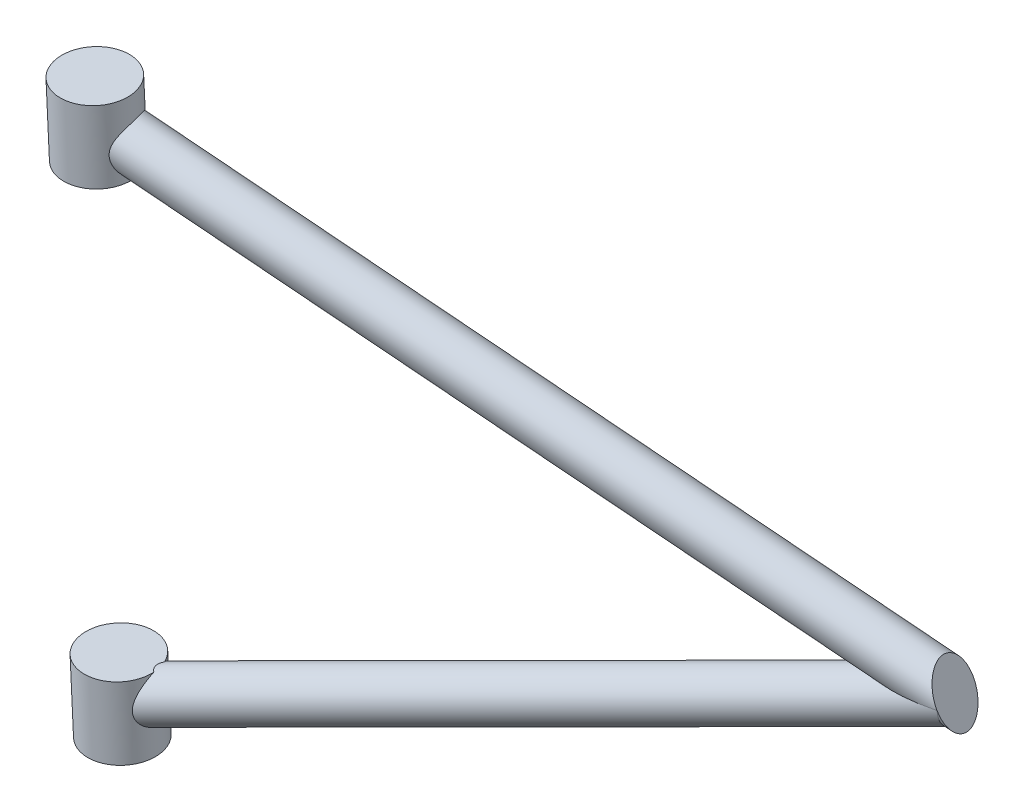
ISO-10303-21;
HEADER;
FILE_DESCRIPTION(('STEP AP214'),'2;1');
FILE_NAME('part.step','',(''),(''),'','','');
FILE_SCHEMA(('AUTOMOTIVE_DESIGN { 1 0 10303 214 1 1 1 1 }'));
ENDSEC;
DATA;
#1=APPLICATION_CONTEXT('core data for automotive mechanical design processes');
#2=APPLICATION_PROTOCOL_DEFINITION('international standard','automotive_design',2000,#1);
#3=PRODUCT_CONTEXT('',#1,'mechanical');
#4=PRODUCT('Part','Part','',(#3));
#5=PRODUCT_RELATED_PRODUCT_CATEGORY('part','',(#4));
#6=PRODUCT_DEFINITION_FORMATION('','',#4);
#7=PRODUCT_DEFINITION_CONTEXT('part definition',#1,'design');
#8=PRODUCT_DEFINITION('design','',#6,#7);
#9=PRODUCT_DEFINITION_SHAPE('','',#8);
#10=(LENGTH_UNIT() NAMED_UNIT(*) SI_UNIT(.MILLI.,.METRE.));
#11=(NAMED_UNIT(*) PLANE_ANGLE_UNIT() SI_UNIT($,.RADIAN.));
#12=(NAMED_UNIT(*) SI_UNIT($,.STERADIAN.) SOLID_ANGLE_UNIT());
#13=UNCERTAINTY_MEASURE_WITH_UNIT(LENGTH_MEASURE(1.E-05),#10,'distance_accuracy_value','');
#14=(GEOMETRIC_REPRESENTATION_CONTEXT(3) GLOBAL_UNCERTAINTY_ASSIGNED_CONTEXT((#13)) GLOBAL_UNIT_ASSIGNED_CONTEXT((#10,
#11,#12)) REPRESENTATION_CONTEXT('',''));
#15=CARTESIAN_POINT('',(0.,0.,0.));
#16=DIRECTION('',(0.,0.,1.));
#17=DIRECTION('',(1.,0.,0.));
#18=AXIS2_PLACEMENT_3D('',#15,#16,#17);
#19=CARTESIAN_POINT('',(255.,-221.47,-254.503));
#20=DIRECTION('',(0.912524270681738,0.366844617908996,-0.18089909266761));
#21=DIRECTION('',(-0.372998472957095,0.927831956321658,0.));
#22=AXIS2_PLACEMENT_3D('',#19,#20,#21);
#23=CYLINDRICAL_SURFACE('',#22,9.52500000000002);
#24=CARTESIAN_POINT('',(293.242179047782,-206.096230762816,-262.084141360994));
#25=DIRECTION('',(0.,0.998892249777093,0.0470560658710238));
#26=DIRECTION('',(0.977268280554209,0.00997618647777122,-0.211771536156257));
#27=AXIS2_PLACEMENT_3D('',#24,#25,#26);
#28=ELLIPSE('',#27,26.6116574264945,9.52500000000002);
#29=CARTESIAN_POINT('',(268.999181284131,-206.479491491884,-253.948395951266));
#30=VERTEX_POINT('',#29);
#31=CARTESIAN_POINT('',(267.803485256219,-206.220132528784,-259.453991316177));
#32=VERTEX_POINT('',#31);
#33=EDGE_CURVE('E80',#30,#32,#28,.F.);
#34=ORIENTED_EDGE('',*,*,#33,.F.);
#35=CARTESIAN_POINT('',(267.803485256219,-206.220132528784,-259.453991316177));
#36=CARTESIAN_POINT('',(267.697365527533,-206.314287046579,-259.698635479323));
#37=CARTESIAN_POINT('',(267.586764390849,-206.42159580225,-259.935753123484));
#38=CARTESIAN_POINT('',(267.3590656013,-206.659148812205,-260.394082141548));
#39=CARTESIAN_POINT('',(267.241984498495,-206.789336331361,-260.615330999056));
#40=CARTESIAN_POINT('',(266.886711742009,-207.206658583498,-261.250682509158));
#41=CARTESIAN_POINT('',(266.641879237606,-207.522929172958,-261.642177585505));
#42=CARTESIAN_POINT('',(266.235273501451,-208.092730241839,-262.239418803081));
#43=CARTESIAN_POINT('',(266.074316155262,-208.329666023735,-262.462324034543));
#44=CARTESIAN_POINT('',(265.753981376019,-208.824652753416,-262.884808049921));
#45=CARTESIAN_POINT('',(265.594604180185,-209.08270681934,-263.084383378549));
#46=CARTESIAN_POINT('',(265.279342301922,-209.618803267741,-263.462697257364));
#47=CARTESIAN_POINT('',(265.123488835937,-209.896969922729,-263.641284482501));
#48=CARTESIAN_POINT('',(264.819309695939,-210.469689099346,-263.97724993632));
#49=CARTESIAN_POINT('',(264.670983486587,-210.764240452564,-264.1346296746));
#50=CARTESIAN_POINT('',(264.381269831893,-211.376181258596,-264.432862120423));
#51=CARTESIAN_POINT('',(264.240163394191,-211.693965555147,-264.573178177829));
#52=CARTESIAN_POINT('',(263.973061649822,-212.344290165365,-264.832817021957));
#53=CARTESIAN_POINT('',(263.847070291525,-212.676834303664,-264.952134327155));
#54=CARTESIAN_POINT('',(263.615479530347,-213.35418344376,-265.169010362527));
#55=CARTESIAN_POINT('',(263.509796042121,-213.698930568173,-265.266659084283));
#56=CARTESIAN_POINT('',(263.323918613269,-214.40060892788,-265.439720146905));
#57=CARTESIAN_POINT('',(263.243704957851,-214.757530501437,-265.515149683131));
#58=CARTESIAN_POINT('',(263.140757197253,-215.337931157684,-265.616682171021));
#59=CARTESIAN_POINT('',(263.107839746575,-215.558288084853,-265.650490284906));
#60=CARTESIAN_POINT('',(263.055221234641,-216.001787504313,-265.708623035463));
#61=CARTESIAN_POINT('',(263.035515613435,-216.224929008417,-265.732950942932));
#62=CARTESIAN_POINT('',(263.010753298342,-216.6726776378,-265.771379849267));
#63=CARTESIAN_POINT('',(263.005680130779,-216.897282829338,-265.785492335551));
#64=CARTESIAN_POINT('',(263.011298244634,-217.346752682923,-265.80274430895));
#65=CARTESIAN_POINT('',(263.021989511733,-217.571617344735,-265.805883806031));
#66=CARTESIAN_POINT('',(263.059984423546,-218.021655112976,-265.800397176217));
#67=CARTESIAN_POINT('',(263.0874217406,-218.246816002228,-265.791675675815));
#68=CARTESIAN_POINT('',(263.159066383468,-218.693611930885,-265.761625241399));
#69=CARTESIAN_POINT('',(263.203273557364,-218.915247002211,-265.740296421595));
#70=CARTESIAN_POINT('',(263.30776437712,-219.353093275263,-265.684545181846));
#71=CARTESIAN_POINT('',(263.368053812421,-219.569302493014,-265.650118044742));
#72=CARTESIAN_POINT('',(263.503297097006,-219.994461443992,-265.567923797466));
#73=CARTESIAN_POINT('',(263.578250721479,-220.203411288453,-265.520156891796));
#74=CARTESIAN_POINT('',(263.733171590505,-220.593225138195,-265.416430865558));
#75=CARTESIAN_POINT('',(263.811987994475,-220.774872676237,-265.36167938882));
#76=CARTESIAN_POINT('',(263.978462432031,-221.130423154988,-265.241300951544));
#77=CARTESIAN_POINT('',(264.06612389616,-221.3043230528,-265.175669764933));
#78=CARTESIAN_POINT('',(264.24857889433,-221.643813586958,-265.03371158526));
#79=CARTESIAN_POINT('',(264.343372946659,-221.80940361801,-264.957383814584));
#80=CARTESIAN_POINT('',(264.538437505506,-222.131975916435,-264.794240719237));
#81=CARTESIAN_POINT('',(264.638708684581,-222.288957121931,-264.707424105006));
#82=CARTESIAN_POINT('',(264.856080793585,-222.613432512373,-264.511904137335));
#83=CARTESIAN_POINT('',(264.973706227715,-222.77974489652,-264.401821371604));
#84=CARTESIAN_POINT('',(265.211812817542,-223.101071675487,-264.168997659305));
#85=CARTESIAN_POINT('',(265.332294133555,-223.25608543406,-264.046256000829));
#86=CARTESIAN_POINT('',(265.574267969116,-223.554796284649,-263.788422034612));
#87=CARTESIAN_POINT('',(265.695760939554,-223.698487995004,-263.653323918668));
#88=CARTESIAN_POINT('',(265.937968608628,-223.9743822208,-263.371221770743));
#89=CARTESIAN_POINT('',(266.058683267141,-224.106584148258,-263.224217130196));
#90=CARTESIAN_POINT('',(266.316388873185,-224.379086894282,-262.894911525225));
#91=CARTESIAN_POINT('',(266.452983883531,-224.517438018628,-262.710680519274));
#92=CARTESIAN_POINT('',(266.720771944835,-224.778357387148,-262.327661237535));
#93=CARTESIAN_POINT('',(266.851964487,-224.900924147083,-262.128871595517));
#94=CARTESIAN_POINT('',(267.106914603057,-225.129934865831,-261.717650437763));
#95=CARTESIAN_POINT('',(267.230671343288,-225.236377018868,-261.505217397907));
#96=CARTESIAN_POINT('',(267.468876424041,-225.43271743723,-261.067853372235));
#97=CARTESIAN_POINT('',(267.583325023973,-225.522616163696,-260.842922735012));
#98=CARTESIAN_POINT('',(267.802315193678,-225.686237507517,-260.379654071813));
#99=CARTESIAN_POINT('',(267.906750630271,-225.759795842173,-260.141207706006));
#100=CARTESIAN_POINT('',(268.102975695885,-225.889205563581,-259.654493838866));
#101=CARTESIAN_POINT('',(268.194765111246,-225.945056651182,-259.406226171689));
#102=CARTESIAN_POINT('',(268.36445666864,-226.038678078082,-258.901741183751));
#103=CARTESIAN_POINT('',(268.44236278672,-226.076453599294,-258.645526163796));
#104=CARTESIAN_POINT('',(268.583397962621,-226.133680431828,-258.127059212255));
#105=CARTESIAN_POINT('',(268.646527716311,-226.15313260619,-257.864807565594));
#106=CARTESIAN_POINT('',(268.75456089052,-226.173041180107,-257.350001463026));
#107=CARTESIAN_POINT('',(268.800236085503,-226.17442507342,-257.097643977992));
#108=CARTESIAN_POINT('',(268.87754495621,-226.160559049983,-256.591249747588));
#109=CARTESIAN_POINT('',(268.909179149581,-226.145309746517,-256.337213064475));
#110=CARTESIAN_POINT('',(268.958465129282,-226.098254186145,-255.829342197431));
#111=CARTESIAN_POINT('',(268.97611791716,-226.066449115471,-255.575508000297));
#112=CARTESIAN_POINT('',(268.997780159279,-225.986437433502,-255.06985384672));
#113=CARTESIAN_POINT('',(269.001789410141,-225.938230577724,-254.818033920359));
#114=CARTESIAN_POINT('',(268.996762287689,-225.825707993507,-254.318544779101));
#115=CARTESIAN_POINT('',(268.987744850636,-225.761415759862,-254.070870067635));
#116=CARTESIAN_POINT('',(268.957530962621,-225.616923119472,-253.580973567274));
#117=CARTESIAN_POINT('',(268.936334552204,-225.536722765687,-253.338751760229));
#118=CARTESIAN_POINT('',(268.882802768389,-225.360597511825,-252.861222854839));
#119=CARTESIAN_POINT('',(268.850461702744,-225.264664589324,-252.625919356878));
#120=CARTESIAN_POINT('',(268.775907958965,-225.057297669075,-252.163861958913));
#121=CARTESIAN_POINT('',(268.733694983814,-224.94586320497,-251.937108316386));
#122=CARTESIAN_POINT('',(268.638427804418,-224.70137759742,-251.481962002));
#123=CARTESIAN_POINT('',(268.584920879624,-224.567498865722,-251.254107944126));
#124=CARTESIAN_POINT('',(268.470559133134,-224.282804564353,-250.811147094706));
#125=CARTESIAN_POINT('',(268.409703629115,-224.13198742202,-250.596041489638));
#126=CARTESIAN_POINT('',(268.282914006161,-223.81350185564,-250.180367343564));
#127=CARTESIAN_POINT('',(268.21698123708,-223.645837906937,-249.979794966055));
#128=CARTESIAN_POINT('',(268.082581578995,-223.293675776162,-249.59495297393));
#129=CARTESIAN_POINT('',(268.014115195036,-223.109180938497,-249.410680134762));
#130=CARTESIAN_POINT('',(267.889441483938,-222.757180467935,-249.090924796078));
#131=CARTESIAN_POINT('',(267.83317936084,-222.592326466294,-248.952538990793));
#132=CARTESIAN_POINT('',(267.722651266223,-222.25151404732,-248.689326778223));
#133=CARTESIAN_POINT('',(267.668384903767,-222.075557823276,-248.564497705929));
#134=CARTESIAN_POINT('',(267.563747133932,-221.713228224221,-248.329677098308));
#135=CARTESIAN_POINT('',(267.513370789218,-221.526868589261,-248.219666618114));
#136=CARTESIAN_POINT('',(267.4182587498,-221.144323935223,-248.015368122386));
#137=CARTESIAN_POINT('',(267.373523009128,-220.948138996235,-247.92107997872));
#138=CARTESIAN_POINT('',(267.291137225037,-220.546013503638,-247.748638257899));
#139=CARTESIAN_POINT('',(267.2535278762,-220.340024858359,-247.670577111481));
#140=CARTESIAN_POINT('',(267.187082074715,-219.920901255214,-247.531833206973));
#141=CARTESIAN_POINT('',(267.158245482821,-219.707766410837,-247.471150173047));
#142=CARTESIAN_POINT('',(267.110235562994,-219.276173299073,-247.367297249279));
#143=CARTESIAN_POINT('',(267.091064070753,-219.05771402867,-247.324130686644));
#144=CARTESIAN_POINT('',(267.062724596509,-218.617469337366,-247.255007864885));
#145=CARTESIAN_POINT('',(267.053556655437,-218.395683902859,-247.229051676181));
#146=CARTESIAN_POINT('',(267.045348670539,-217.968250588951,-247.19502778059));
#147=CARTESIAN_POINT('',(267.045565007181,-217.762713603364,-247.185707712271));
#148=CARTESIAN_POINT('',(267.053792930777,-217.351595295943,-247.180270105336));
#149=CARTESIAN_POINT('',(267.061807327794,-217.146013984837,-247.184157327279));
#150=CARTESIAN_POINT('',(267.096519483449,-216.530787761495,-247.214349430058));
#151=CARTESIAN_POINT('',(267.133884626441,-216.122537567518,-247.259176045046));
#152=CARTESIAN_POINT('',(267.222325638461,-215.381368977004,-247.380627271946));
#153=CARTESIAN_POINT('',(267.270207937088,-215.046942942879,-247.450938854214));
#154=CARTESIAN_POINT('',(267.377018936706,-214.386439361572,-247.618189330147));
#155=CARTESIAN_POINT('',(267.435954174913,-214.060366885459,-247.71514399763));
#156=CARTESIAN_POINT('',(267.561389779737,-213.416716646475,-247.9336507454));
#157=CARTESIAN_POINT('',(267.627918198398,-213.099176112066,-248.055295417468));
#158=CARTESIAN_POINT('',(267.765029228637,-212.474758490432,-248.321306075396));
#159=CARTESIAN_POINT('',(267.835611193412,-212.167879714442,-248.465668442679));
#160=CARTESIAN_POINT('',(267.980843351858,-211.553014635479,-248.782694691098));
#161=CARTESIAN_POINT('',(268.0555401776,-211.245519516577,-248.956290190469));
#162=CARTESIAN_POINT('',(268.202991109672,-210.644308733987,-249.32672039377));
#163=CARTESIAN_POINT('',(268.275745048135,-210.350594259308,-249.523557097843));
#164=CARTESIAN_POINT('',(268.415818484292,-209.780532346564,-249.939235286135));
#165=CARTESIAN_POINT('',(268.483167743511,-209.504091965957,-250.15793886129));
#166=CARTESIAN_POINT('',(268.609798910895,-208.969228518461,-250.618611208845));
#167=CARTESIAN_POINT('',(268.669081435061,-208.710804076553,-250.860578202365));
#168=CARTESIAN_POINT('',(268.765852461967,-208.26341636258,-251.318946387353));
#169=CARTESIAN_POINT('',(268.805338585521,-208.070684366789,-251.531243647368));
#170=CARTESIAN_POINT('',(268.874936386724,-207.701749340829,-251.970974377624));
#171=CARTESIAN_POINT('',(268.905055549102,-207.525533192642,-252.198395585667));
#172=CARTESIAN_POINT('',(268.95419156177,-207.190432647219,-252.670920659274));
#173=CARTESIAN_POINT('',(268.973077255322,-207.031769957774,-252.916197267341));
#174=CARTESIAN_POINT('',(268.997070890751,-206.73735109464,-253.421580500344));
#175=CARTESIAN_POINT('',(269.002142266349,-206.601656605006,-253.681724626914));
#176=CARTESIAN_POINT('',(268.999181284131,-206.479491491884,-253.948395951266));
#177=B_SPLINE_CURVE_WITH_KNOTS('',3,(#35,#36,#37,#38,#39,#40,#41,#42,#43,#44,#45,#46,#47,#48,
#49,#50,#51,#52,#53,#54,#55,#56,#57,#58,#59,#60,#61,#62,#63,#64,#65,#66,#67,#68,#69,#70,#71,#72,
#73,#74,#75,#76,#77,#78,#79,#80,#81,#82,#83,#84,#85,#86,#87,#88,#89,#90,#91,#92,#93,#94,#95,#96,
#97,#98,#99,#100,#101,#102,#103,#104,#105,#106,#107,#108,#109,#110,#111,#112,#113,#114,#115,
#116,#117,#118,#119,#120,#121,#122,#123,#124,#125,#126,#127,#128,#129,#130,#131,#132,#133,#134,
#135,#136,#137,#138,#139,#140,#141,#142,#143,#144,#145,#146,#147,#148,#149,#150,#151,#152,#153,
#154,#155,#156,#157,#158,#159,#160,#161,#162,#163,#164,#165,#166,#167,#168,#169,#170,#171,#172,
#173,#174,#175,#176),.UNSPECIFIED.,.F.,.F.,(4,2,2,2,2,2,2,2,2,2,2,2,2,2,2,2,2,2,2,2,2,2,2,2,2,2,
2,2,2,2,2,2,2,2,2,2,2,2,2,2,2,2,2,2,2,2,2,2,2,2,2,2,2,2,2,2,2,2,2,2,2,2,2,2,2,2,2,2,2,2,4),(0.,
0.847248957157209,1.69242580052789,3.3627657640452,4.45048572585789,5.53836658145481,
6.63366380567474,7.7288830228253,8.85260269563985,9.97661527103477,11.0958685200099,
12.214253292855,12.8897999019046,13.5651132316117,14.2396659749776,14.9142181056374,
15.594226457347,16.2742286490018,16.9544759652561,17.6347128537404,18.2503947330981,
18.8663163283093,19.4822827225457,20.0983249244541,20.7922888745161,21.4862918728688,
22.1806227833065,22.8749892047906,23.6775899204243,24.4802660513897,25.2830320066978,
26.0857755818625,26.8962571907386,27.7067524913827,28.517015299415,29.3272399417498,
30.0956997057354,30.8641311366941,31.6325075166236,32.4008953503885,33.1681673395538,
33.935436774422,34.7030986823461,35.4707836899619,36.2787608460513,37.0868130815586,
37.8946512231765,38.7023291903113,39.3690957519282,40.0357310011377,40.7015057318462,
41.3672750364114,42.0367385694382,42.7061914757579,43.3757714834116,44.0453542307185,
44.6619834053258,45.2788348670851,46.5121712393655,47.5460979811356,48.580638174395,
49.6191322393976,50.6574610554916,51.7392464537718,52.8211250187368,53.8965658681635,
54.9719245473783,55.8393415741109,56.7060636942321,57.5827161452231,58.4616868366877),.UNSPECIFIED.);
#178=EDGE_CURVE('E86',#32,#30,#177,.T.);
#179=ORIENTED_EDGE('',*,*,#178,.F.);
#180=EDGE_LOOP('',(#34,#179));
#181=FACE_BOUND('',#180,.T.);
#182=CARTESIAN_POINT('',(536.966082,-108.116588,-310.400043));
#183=DIRECTION('',(0.977042799081254,0.0314302037809526,-0.210711914835768));
#184=DIRECTION('',(-0.0209918277884314,0.998447490299481,0.0515941109116967));
#185=AXIS2_PLACEMENT_3D('',#182,#183,#184);
#186=ELLIPSE('',#185,10.1198136751925,9.525);
#187=CARTESIAN_POINT('',(538.985442921555,-108.554608710622,-301.10187413051));
#188=VERTEX_POINT('',#187);
#189=CARTESIAN_POINT('',(534.946721078445,-107.678567289377,-319.69821186949));
#190=VERTEX_POINT('',#189);
#191=EDGE_CURVE('E93',#188,#190,#186,.T.);
#192=ORIENTED_EDGE('',*,*,#191,.F.);
#193=CARTESIAN_POINT('',(536.966082,-108.116588,-310.400043));
#194=DIRECTION('',(-0.0209918277884314,0.998447490299481,0.0515941109116967));
#195=DIRECTION('',(0.977042799081254,0.0314302037809526,-0.210711914835768));
#196=AXIS2_PLACEMENT_3D('',#193,#194,#195);
#197=ELLIPSE('',#196,28.1983093968674,9.525);
#198=EDGE_CURVE('E119',#190,#188,#197,.T.);
#199=ORIENTED_EDGE('',*,*,#198,.F.);
#200=EDGE_LOOP('',(#192,#199));
#201=FACE_BOUND('',#200,.T.);
#202=ADVANCED_FACE('F67',(#181,#201),#23,.T.);
#203=CARTESIAN_POINT('',(255.,-14.5,-244.753));
#204=DIRECTION('',(0.926705770492292,-0.307678965136663,-0.215754650815965));
#205=DIRECTION('',(0.31510033175296,0.949058365396552,0.));
#206=AXIS2_PLACEMENT_3D('',#203,#204,#205);
#207=CYLINDRICAL_SURFACE('',#206,9.52499999999998);
#208=CARTESIAN_POINT('',(268.726824760883,-9.02122951178209,-247.250098117072));
#209=CARTESIAN_POINT('',(268.676288530235,-9.00445198597454,-247.501640042863));
#210=CARTESIAN_POINT('',(268.618762691404,-8.99633112635366,-247.752376592043));
#211=CARTESIAN_POINT('',(268.4902025195,-8.99747023854408,-248.250336732159));
#212=CARTESIAN_POINT('',(268.419166756123,-9.00673205158942,-248.497559948154));
#213=CARTESIAN_POINT('',(268.26430576037,-9.04257696507422,-248.986808957903));
#214=CARTESIAN_POINT('',(268.180474735553,-9.06916792837075,-249.228832340788));
#215=CARTESIAN_POINT('',(268.001055496051,-9.13949319043361,-249.705915076184));
#216=CARTESIAN_POINT('',(267.905467525869,-9.18322713272696,-249.940974573394));
#217=CARTESIAN_POINT('',(267.704010049842,-9.28743506475234,-250.402102427346));
#218=CARTESIAN_POINT('',(267.59816639998,-9.34786763304748,-250.628191468837));
#219=CARTESIAN_POINT('',(267.37740915214,-9.48519116807679,-251.07072761641));
#220=CARTESIAN_POINT('',(267.262495497646,-9.56208223736834,-251.2871746624));
#221=CARTESIAN_POINT('',(267.025135257315,-9.73200191766136,-251.709419423601));
#222=CARTESIAN_POINT('',(266.902686502832,-9.82503518863161,-251.91521404131));
#223=CARTESIAN_POINT('',(266.652004823838,-10.0268960232909,-252.315201896446));
#224=CARTESIAN_POINT('',(266.523771766162,-10.135723950729,-252.509394866543));
#225=CARTESIAN_POINT('',(266.257990376271,-10.37372353331,-252.893239052608));
#226=CARTESIAN_POINT('',(266.120276202222,-10.5035511022297,-253.082369018426));
#227=CARTESIAN_POINT('',(265.842879496114,-10.7797917911539,-253.446577113206));
#228=CARTESIAN_POINT('',(265.703196820934,-10.9262061226147,-253.621654214184));
#229=CARTESIAN_POINT('',(265.424383563167,-11.2354446840216,-253.957164411029));
#230=CARTESIAN_POINT('',(265.285252996112,-11.3982693722353,-254.117597097705));
#231=CARTESIAN_POINT('',(265.010343203832,-11.7401856535472,-254.423270297936));
#232=CARTESIAN_POINT('',(264.874563513612,-11.9192749733077,-254.568512928546));
#233=CARTESIAN_POINT('',(264.628040923878,-12.267307728285,-254.824035864827));
#234=CARTESIAN_POINT('',(264.516456347192,-12.43415469064,-254.936363174754));
#235=CARTESIAN_POINT('',(264.300224103738,-12.7795307333661,-255.149079245481));
#236=CARTESIAN_POINT('',(264.195575195986,-12.958057712435,-255.249470144605));
#237=CARTESIAN_POINT('',(263.99561101844,-13.3262181674255,-255.43789563867));
#238=CARTESIAN_POINT('',(263.900285459151,-13.515839021735,-255.525943902869));
#239=CARTESIAN_POINT('',(263.721185832183,-13.9056787326092,-255.689509327515));
#240=CARTESIAN_POINT('',(263.637411641543,-14.1058974763313,-255.765026621352));
#241=CARTESIAN_POINT('',(263.483061700098,-14.5174320546719,-255.90382351464));
#242=CARTESIAN_POINT('',(263.412592894543,-14.7288216595263,-255.967004082436));
#243=CARTESIAN_POINT('',(263.287610092421,-15.1596821705019,-256.080277081496));
#244=CARTESIAN_POINT('',(263.233095631416,-15.3791528411706,-256.130369893746));
#245=CARTESIAN_POINT('',(263.141372793277,-15.8241215844694,-256.217531734547));
#246=CARTESIAN_POINT('',(263.104157846816,-16.049617334677,-256.254605705569));
#247=CARTESIAN_POINT('',(263.047547142388,-16.504520885996,-256.316057701449));
#248=CARTESIAN_POINT('',(263.028150729856,-16.7339285430879,-256.340436192663));
#249=CARTESIAN_POINT('',(263.008147517757,-17.1671959806575,-256.374834768234));
#250=CARTESIAN_POINT('',(263.005587390457,-17.3708635549028,-256.38621346761));
#251=CARTESIAN_POINT('',(263.013423633696,-17.7782789631749,-256.399930904499));
#252=CARTESIAN_POINT('',(263.023824632083,-17.9820267998868,-256.402266411863));
#253=CARTESIAN_POINT('',(263.0731348909,-18.5918328562219,-256.396378199163));
#254=CARTESIAN_POINT('',(263.130151891372,-18.9964409360988,-256.375258802721));
#255=CARTESIAN_POINT('',(263.267231293086,-19.7115667802688,-256.309632909995));
#256=CARTESIAN_POINT('',(263.340027517566,-20.024140917216,-256.270908733129));
#257=CARTESIAN_POINT('',(263.5055674067,-20.6412662141407,-256.17516250565));
#258=CARTESIAN_POINT('',(263.598321825263,-20.9458129490835,-256.118130582245));
#259=CARTESIAN_POINT('',(263.799977631537,-21.5463255489647,-255.986321595786));
#260=CARTESIAN_POINT('',(263.908916712175,-21.842269401345,-255.911502857612));
#261=CARTESIAN_POINT('',(264.139319909855,-22.4241037243651,-255.744444398948));
#262=CARTESIAN_POINT('',(264.260782060857,-22.7099957636511,-255.652207411125));
#263=CARTESIAN_POINT('',(264.518273357768,-23.2820834100239,-255.446189945533));
#264=CARTESIAN_POINT('',(264.654686517617,-23.5678532153795,-255.331707742645));
#265=CARTESIAN_POINT('',(264.935086867388,-24.1269581013663,-255.083176933669));
#266=CARTESIAN_POINT('',(265.07907503956,-24.4002915607677,-254.949125786062));
#267=CARTESIAN_POINT('',(265.371833191247,-24.9328068305056,-254.660802140949));
#268=CARTESIAN_POINT('',(265.520596114291,-25.1920081230896,-254.50655853266));
#269=CARTESIAN_POINT('',(265.82060268252,-25.6948392265771,-254.176631414043));
#270=CARTESIAN_POINT('',(265.971845609508,-25.9384734489337,-254.000954019127));
#271=CARTESIAN_POINT('',(266.238676319168,-26.352537856558,-253.670966430631));
#272=CARTESIAN_POINT('',(266.354281833975,-26.5267059850453,-253.521351987368));
#273=CARTESIAN_POINT('',(266.584224114413,-26.8631525877641,-253.208346635083));
#274=CARTESIAN_POINT('',(266.698560915827,-27.0254313980387,-253.044956115713));
#275=CARTESIAN_POINT('',(266.924479383203,-27.3362632983389,-252.70415754013));
#276=CARTESIAN_POINT('',(267.036063645957,-27.4848297185091,-252.526763415229));
#277=CARTESIAN_POINT('',(267.255039467324,-27.7664131295551,-252.157647868692));
#278=CARTESIAN_POINT('',(267.362432451144,-27.8994354372983,-251.965931383022));
#279=CARTESIAN_POINT('',(267.550344550156,-28.1227776492559,-251.608278452165));
#280=CARTESIAN_POINT('',(267.631927577974,-28.2163071954066,-251.444902454867));
#281=CARTESIAN_POINT('',(267.790374647105,-28.3907890051595,-251.109476653143));
#282=CARTESIAN_POINT('',(267.867241301295,-28.4717482714663,-250.9374317493));
#283=CARTESIAN_POINT('',(268.01530363148,-28.619897644449,-250.585235195171));
#284=CARTESIAN_POINT('',(268.086501600706,-28.6870933365689,-250.405086869704));
#285=CARTESIAN_POINT('',(268.222306872138,-28.806615573027,-250.037493012394));
#286=CARTESIAN_POINT('',(268.286914142955,-28.8589420465497,-249.850047445803));
#287=CARTESIAN_POINT('',(268.409046184096,-28.9480438917704,-249.467819731855));
#288=CARTESIAN_POINT('',(268.466522366864,-28.9847163359656,-249.272997926722));
#289=CARTESIAN_POINT('',(268.573140792532,-29.0413117188694,-248.878685628907));
#290=CARTESIAN_POINT('',(268.622283046722,-29.0612346802655,-248.67919514255));
#291=CARTESIAN_POINT('',(268.711681410468,-29.0839959537429,-248.277299485232));
#292=CARTESIAN_POINT('',(268.751938745158,-29.0868366227073,-248.074894720225));
#293=CARTESIAN_POINT('',(268.823289630843,-29.0755140053631,-247.668961678572));
#294=CARTESIAN_POINT('',(268.854383615496,-29.0613515238959,-247.465433455559));
#295=CARTESIAN_POINT('',(268.904801786241,-29.0186999138597,-247.078966926209));
#296=CARTESIAN_POINT('',(268.924981038937,-28.9917515757181,-246.895966354055));
#297=CARTESIAN_POINT('',(268.958064013113,-28.9249745078107,-246.531605969082));
#298=CARTESIAN_POINT('',(268.970965059182,-28.8851410500324,-246.350246783697));
#299=CARTESIAN_POINT('',(268.989793396049,-28.7933263723226,-245.990275203744));
#300=CARTESIAN_POINT('',(268.995720570564,-28.7413449498529,-245.811662855028));
#301=CARTESIAN_POINT('',(269.001025347498,-28.6260569238007,-245.458019234233));
#302=CARTESIAN_POINT('',(269.000401527856,-28.5627478642001,-245.28298874795));
#303=CARTESIAN_POINT('',(268.99165195885,-28.3986733966934,-244.869122410357));
#304=CARTESIAN_POINT('',(268.98066984623,-28.2929735056765,-244.632291259126));
#305=CARTESIAN_POINT('',(268.948385099839,-28.0635504732574,-244.168261413666));
#306=CARTESIAN_POINT('',(268.927079042074,-27.9398213618909,-243.94106594237));
#307=CARTESIAN_POINT('',(268.875600840143,-27.6762679414899,-243.496810164444));
#308=CARTESIAN_POINT('',(268.845414580554,-27.5364182250289,-243.279766636226));
#309=CARTESIAN_POINT('',(268.777653421011,-27.2426584721528,-242.856685745628));
#310=CARTESIAN_POINT('',(268.740078315457,-27.0887480445503,-242.650648689715));
#311=CARTESIAN_POINT('',(268.643386483254,-26.7070822330017,-242.173026496221));
#312=CARTESIAN_POINT('',(268.581530156878,-26.4736150303135,-241.906546891847));
#313=CARTESIAN_POINT('',(268.449793003767,-25.9860455351558,-241.395296604415));
#314=CARTESIAN_POINT('',(268.379908970078,-25.7319350079263,-241.150534666946));
#315=CARTESIAN_POINT('',(268.235217433814,-25.2048385830268,-240.682382562861));
#316=CARTESIAN_POINT('',(268.160397503455,-24.9318049453811,-240.45905011023));
#317=CARTESIAN_POINT('',(268.00928117974,-24.3692117493213,-240.034948103136));
#318=CARTESIAN_POINT('',(267.932984987262,-24.0796544290064,-239.834175503873));
#319=CARTESIAN_POINT('',(267.780354614498,-23.4774373291483,-239.451118710635));
#320=CARTESIAN_POINT('',(267.704070744199,-23.1643731990062,-239.2694488849));
#321=CARTESIAN_POINT('',(267.557528007869,-22.5228634270082,-238.932359860162));
#322=CARTESIAN_POINT('',(267.48727104527,-22.1944129760741,-238.776948939392));
#323=CARTESIAN_POINT('',(267.357638693295,-21.5245086942079,-238.495699153315));
#324=CARTESIAN_POINT('',(267.298221230536,-21.1831116344125,-238.369745388929));
#325=CARTESIAN_POINT('',(267.195077168894,-20.4877413538703,-238.150563149337));
#326=CARTESIAN_POINT('',(267.151335785603,-20.1337803306224,-238.057303841185));
#327=CARTESIAN_POINT('',(267.098540172103,-19.5641256360974,-237.939120561874));
#328=CARTESIAN_POINT('',(267.082619957234,-19.3515806267613,-237.901874421257));
#329=CARTESIAN_POINT('',(267.059008416033,-18.9240682133002,-237.84149928021));
#330=CARTESIAN_POINT('',(267.051314145636,-18.7091017036844,-237.818365230336));
#331=CARTESIAN_POINT('',(267.044953531713,-18.2781857655523,-237.787305684723));
#332=CARTESIAN_POINT('',(267.04627587948,-18.0622379076186,-237.779361154192));
#333=CARTESIAN_POINT('',(267.058392872335,-17.6305877960783,-237.779550424714));
#334=CARTESIAN_POINT('',(267.069187592679,-17.4148855444368,-237.787684353508));
#335=CARTESIAN_POINT('',(267.100361653992,-16.9843018184482,-237.820759015783));
#336=CARTESIAN_POINT('',(267.120791424559,-16.769430731762,-237.845788480904));
#337=CARTESIAN_POINT('',(267.170767400276,-16.3434622054168,-237.912997356413));
#338=CARTESIAN_POINT('',(267.200313653999,-16.1323647858708,-237.955176858179));
#339=CARTESIAN_POINT('',(267.267565233735,-15.7154611340881,-238.056546867933));
#340=CARTESIAN_POINT('',(267.305276825023,-15.5096591014379,-238.115750450031));
#341=CARTESIAN_POINT('',(267.387470310165,-15.1049247720286,-238.25060045492));
#342=CARTESIAN_POINT('',(267.431952283366,-14.9059925558149,-238.326247070423));
#343=CARTESIAN_POINT('',(267.523400302146,-14.5271276802228,-238.488421201792));
#344=CARTESIAN_POINT('',(267.570083125769,-14.3467569947386,-238.574090202722));
#345=CARTESIAN_POINT('',(267.666615954268,-13.9936545286482,-238.758536391542));
#346=CARTESIAN_POINT('',(267.71646718663,-13.8209257531272,-238.857318676041));
#347=CARTESIAN_POINT('',(267.817892035837,-13.4836141022372,-239.067097201745));
#348=CARTESIAN_POINT('',(267.86946556749,-13.3190308249573,-239.178092839452));
#349=CARTESIAN_POINT('',(267.972983266519,-12.9982498891615,-239.411457750653));
#350=CARTESIAN_POINT('',(268.024927478074,-12.8420532497334,-239.533828401448));
#351=CARTESIAN_POINT('',(268.136276284712,-12.5135604042263,-239.809846608741));
#352=CARTESIAN_POINT('',(268.195523474195,-12.3427654691848,-239.965347052666));
#353=CARTESIAN_POINT('',(268.310985581411,-12.0129307036202,-240.289391481785));
#354=CARTESIAN_POINT('',(268.367200259503,-11.8538918017375,-240.457936495255));
#355=CARTESIAN_POINT('',(268.475003110589,-11.5476298350489,-240.807046987239));
#356=CARTESIAN_POINT('',(268.526588011956,-11.4004151334004,-240.987620811335));
#357=CARTESIAN_POINT('',(268.6236225188,-11.1181177051641,-241.359577026843));
#358=CARTESIAN_POINT('',(268.669071891497,-10.9830354389418,-241.550959827954));
#359=CARTESIAN_POINT('',(268.758521739242,-10.7067087656077,-241.971660604417));
#360=CARTESIAN_POINT('',(268.801375687973,-10.5673678252388,-242.202478098994));
#361=CARTESIAN_POINT('',(268.875613668845,-10.3053037819552,-242.675169414416));
#362=CARTESIAN_POINT('',(268.906996231909,-10.1825828087323,-242.917044646905));
#363=CARTESIAN_POINT('',(268.956794051521,-9.9543710496175,-243.40989743261));
#364=CARTESIAN_POINT('',(268.975217768954,-9.84886905600585,-243.660868934051));
#365=CARTESIAN_POINT('',(268.997914998214,-9.65557684028918,-244.170139318301));
#366=CARTESIAN_POINT('',(269.002191274601,-9.56778316094173,-244.428436759592));
#367=CARTESIAN_POINT('',(268.996329928969,-9.42594886366718,-244.898919278565));
#368=CARTESIAN_POINT('',(268.98886466854,-9.36866599817176,-245.110169551247));
#369=CARTESIAN_POINT('',(268.96390061509,-9.26611670457977,-245.535049909392));
#370=CARTESIAN_POINT('',(268.946399391262,-9.220853191573,-245.748680559108));
#371=CARTESIAN_POINT('',(268.901179366547,-9.14259773632198,-246.177080211652));
#372=CARTESIAN_POINT('',(268.873461829238,-9.10960427750102,-246.391849070468));
#373=CARTESIAN_POINT('',(268.807790515051,-9.05606213404447,-246.821305816148));
#374=CARTESIAN_POINT('',(268.76983957727,-9.03551000288257,-247.035993708957));
#375=CARTESIAN_POINT('',(268.726824760883,-9.02122951178209,-247.250098117072));
#376=B_SPLINE_CURVE_WITH_KNOTS('',3,(#208,#209,#210,#211,#212,#213,#214,#215,#216,#217,#218,
#219,#220,#221,#222,#223,#224,#225,#226,#227,#228,#229,#230,#231,#232,#233,#234,#235,#236,#237,
#238,#239,#240,#241,#242,#243,#244,#245,#246,#247,#248,#249,#250,#251,#252,#253,#254,#255,#256,
#257,#258,#259,#260,#261,#262,#263,#264,#265,#266,#267,#268,#269,#270,#271,#272,#273,#274,#275,
#276,#277,#278,#279,#280,#281,#282,#283,#284,#285,#286,#287,#288,#289,#290,#291,#292,#293,#294,
#295,#296,#297,#298,#299,#300,#301,#302,#303,#304,#305,#306,#307,#308,#309,#310,#311,#312,#313,
#314,#315,#316,#317,#318,#319,#320,#321,#322,#323,#324,#325,#326,#327,#328,#329,#330,#331,#332,
#333,#334,#335,#336,#337,#338,#339,#340,#341,#342,#343,#344,#345,#346,#347,#348,#349,#350,#351,
#352,#353,#354,#355,#356,#357,#358,#359,#360,#361,#362,#363,#364,#365,#366,#367,#368,#369,#370,
#371,#372,#373,#374,#375),.UNSPECIFIED.,.T.,.F.,(4,2,2,2,2,2,2,2,2,2,2,2,2,2,2,2,2,2,2,2,2,2,2,
2,2,2,2,2,2,2,2,2,2,2,2,2,2,2,2,2,2,2,2,2,2,2,2,2,2,2,2,2,2,2,2,2,2,2,2,2,2,2,2,2,2,2,2,2,2,2,2,
2,2,2,2,2,2,2,2,2,2,2,2,4),(0.,0.771143389564144,1.54236846596876,2.31394371872187,
3.08550292810629,3.85516518215106,4.62483223230957,5.39472184256604,6.16462918610631,
6.96642497401414,7.76827936090845,8.57015614620314,9.37192102368296,10.0613036990496,
10.7505626897401,11.4390522029537,12.1275343868521,12.8213345268121,13.5151144679663,
14.2086307370965,14.9021215288121,15.5134762726715,16.1250493670029,17.348233364939,
18.3168394884161,19.2859688307074,20.2573916532932,21.2286622004461,22.2379356933858,
23.2473403826863,24.2553163916826,25.2630054781634,26.0336365747892,26.804245881665,
27.574097991715,28.3436859980542,28.95863636804,29.5732429201388,30.1875995602927,
30.8019591263042,31.4202981960356,32.038636428207,32.6568893448735,33.275112997795,
33.8327231693502,34.390538180614,34.9483624927723,35.5063078973024,36.2838802265422,
37.0617106186656,37.8407841450655,38.6198793529212,39.6972588965833,40.7750703446171,
41.8557075522295,42.9361987355547,44.0447059876021,45.1535620519159,46.2580180144978,
47.3614295853307,48.0100051506859,48.6583485130409,49.3058788681169,49.9534143678213,
50.6043773156448,51.2553437319283,51.9068114170006,52.5582867376474,53.1728779178945,
53.7877086684453,54.4025090520381,55.0173839737455,55.7320497140423,56.4467718474946,
57.1619951260648,57.8772455323467,58.6952677739919,59.5133947384734,60.330987047306,
61.1484195805351,61.8048961444055,62.4615317803953,63.1180862293321,63.7744587146553),.UNSPECIFIED.);
#377=CARTESIAN_POINT('',(268.726824760883,-9.02122951178209,-247.250098117072));
#378=VERTEX_POINT('',#377);
#379=EDGE_CURVE('E12',#378,#378,#376,.T.);
#380=ORIENTED_EDGE('',*,*,#379,.F.);
#381=EDGE_LOOP('',(#380));
#382=FACE_BOUND('',#381,.T.);
#383=CARTESIAN_POINT('',(536.966082,-108.116588,-310.400043));
#384=DIRECTION('',(0.912524270681739,0.366844617908996,-0.18089909266761));
#385=DIRECTION('',(0.349789570295045,-0.929144915987946,-0.119737135453293));
#386=AXIS2_PLACEMENT_3D('',#383,#384,#385);
#387=ELLIPSE('',#386,12.3412648453571,9.52499999999998);
#388=EDGE_CURVE('E112',#188,#190,#387,.F.);
#389=ORIENTED_EDGE('',*,*,#388,.T.);
#390=ORIENTED_EDGE('',*,*,#198,.T.);
#391=EDGE_LOOP('',(#389,#390));
#392=FACE_BOUND('',#391,.T.);
#393=ADVANCED_FACE('F139',(#382,#392),#207,.T.);
#394=EDGE_CURVE('E108',#190,#188,#387,.F.);
#395=ORIENTED_EDGE('',*,*,#394,.T.);
#396=ORIENTED_EDGE('',*,*,#191,.T.);
#397=EDGE_LOOP('',(#395,#396));
#398=FACE_BOUND('',#397,.T.);
#399=ADVANCED_FACE('F142',(#398),#207,.T.);
#400=CARTESIAN_POINT('',(536.966082,-108.116588,-310.400043));
#401=DIRECTION('',(0.912524270681739,0.366844617908996,-0.18089909266761));
#402=DIRECTION('',(-0.372998472957094,0.927831956321658,0.));
#403=AXIS2_PLACEMENT_3D('',#400,#401,#402);
#404=PLANE('',#403);
#405=ORIENTED_EDGE('',*,*,#388,.F.);
#406=ORIENTED_EDGE('',*,*,#394,.F.);
#407=EDGE_LOOP('',(#405,#406));
#408=FACE_BOUND('',#407,.T.);
#409=ADVANCED_FACE('F69',(#408),#404,.T.);
#410=CARTESIAN_POINT('',(255.,-236.453384,-255.208841));
#411=DIRECTION('',(0.,0.998892249777093,0.0470560658710238));
#412=DIRECTION('',(0.,-0.0470560658710238,0.998892249777093));
#413=AXIS2_PLACEMENT_3D('',#410,#411,#412);
#414=PLANE('',#413);
#415=CARTESIAN_POINT('',(255.,-236.453384,-255.208841));
#416=DIRECTION('',(0.,0.998892249777093,0.0470560658710238));
#417=DIRECTION('',(0.,-0.0470560658710238,0.998892249777093));
#418=AXIS2_PLACEMENT_3D('',#415,#416,#417);
#419=CIRCLE('',#418,14.);
#420=CARTESIAN_POINT('',(255.,-237.112168922194,-241.224349503121));
#421=VERTEX_POINT('',#420);
#422=EDGE_CURVE('E109',#421,#421,#419,.T.);
#423=ORIENTED_EDGE('',*,*,#422,.F.);
#424=EDGE_LOOP('',(#423));
#425=FACE_BOUND('',#424,.T.);
#426=ADVANCED_FACE('F135',(#425),#414,.F.);
#427=CARTESIAN_POINT('',(255.,-206.486616,-253.797159));
#428=DIRECTION('',(0.,0.998892249777093,0.0470560658710238));
#429=DIRECTION('',(0.,-0.0470560658710238,0.998892249777093));
#430=AXIS2_PLACEMENT_3D('',#427,#428,#429);
#431=PLANE('',#430);
#432=CARTESIAN_POINT('',(255.,-206.486616,-253.797159));
#433=DIRECTION('',(0.,0.998892249777093,0.0470560658710238));
#434=DIRECTION('',(0.,-0.0470560658710238,0.998892249777093));
#435=AXIS2_PLACEMENT_3D('',#432,#433,#434);
#436=CIRCLE('',#435,14.);
#437=EDGE_CURVE('E105',#32,#30,#436,.T.);
#438=ORIENTED_EDGE('',*,*,#437,.T.);
#439=ORIENTED_EDGE('',*,*,#33,.T.);
#440=EDGE_LOOP('',(#438,#439));
#441=FACE_BOUND('',#440,.T.);
#442=ADVANCED_FACE('F107',(#441),#431,.T.);
#443=CARTESIAN_POINT('',(255.,-236.453384,-255.208841));
#444=DIRECTION('',(0.,0.998892249777092,0.0470560658710293));
#445=DIRECTION('',(0.,-0.0470560658710293,0.998892249777092));
#446=AXIS2_PLACEMENT_3D('',#443,#444,#445);
#447=CYLINDRICAL_SURFACE('',#446,14.);
#448=ORIENTED_EDGE('',*,*,#437,.F.);
#449=ORIENTED_EDGE('',*,*,#178,.T.);
#450=EDGE_LOOP('',(#448,#449));
#451=FACE_BOUND('',#450,.T.);
#452=ORIENTED_EDGE('',*,*,#422,.T.);
#453=EDGE_LOOP('',(#452));
#454=FACE_BOUND('',#453,.T.);
#455=ADVANCED_FACE('F103',(#451,#454),#447,.T.);
#456=CARTESIAN_POINT('',(255.,-29.4833837,-245.458841));
#457=DIRECTION('',(0.,0.998892249734874,0.0470560667672377));
#458=DIRECTION('',(0.,-0.0470560667672377,0.998892249734874));
#459=AXIS2_PLACEMENT_3D('',#456,#457,#458);
#460=PLANE('',#459);
#461=CARTESIAN_POINT('',(255.,-29.4833837,-245.458841));
#462=DIRECTION('',(0.,0.998892249734874,0.0470560667672377));
#463=DIRECTION('',(0.,-0.0470560667672377,0.998892249734874));
#464=AXIS2_PLACEMENT_3D('',#461,#462,#463);
#465=CIRCLE('',#464,14.);
#466=CARTESIAN_POINT('',(255.,-30.1421686347413,-231.474349503712));
#467=VERTEX_POINT('',#466);
#468=EDGE_CURVE('E270',#467,#467,#465,.T.);
#469=ORIENTED_EDGE('',*,*,#468,.F.);
#470=EDGE_LOOP('',(#469));
#471=FACE_BOUND('',#470,.T.);
#472=ADVANCED_FACE('F131',(#471),#460,.F.);
#473=CARTESIAN_POINT('',(255.,0.483383728000001,-244.047159));
#474=DIRECTION('',(0.,0.998892249734874,0.0470560667672377));
#475=DIRECTION('',(0.,-0.0470560667672377,0.998892249734874));
#476=AXIS2_PLACEMENT_3D('',#473,#474,#475);
#477=PLANE('',#476);
#478=CARTESIAN_POINT('',(255.,0.483383728000001,-244.047159));
#479=DIRECTION('',(0.,0.998892249734874,0.0470560667672377));
#480=DIRECTION('',(0.,-0.0470560667672377,0.998892249734874));
#481=AXIS2_PLACEMENT_3D('',#478,#479,#480);
#482=CIRCLE('',#481,14.);
#483=CARTESIAN_POINT('',(255.,-0.175401206741327,-230.062667503712));
#484=VERTEX_POINT('',#483);
#485=EDGE_CURVE('E115',#484,#484,#482,.T.);
#486=ORIENTED_EDGE('',*,*,#485,.T.);
#487=EDGE_LOOP('',(#486));
#488=FACE_BOUND('',#487,.T.);
#489=ADVANCED_FACE('F177',(#488),#477,.T.);
#490=CARTESIAN_POINT('',(255.,-29.4833837,-245.458841));
#491=DIRECTION('',(0.,0.998892249734874,0.0470560667672367));
#492=DIRECTION('',(0.,-0.0470560667672367,0.998892249734874));
#493=AXIS2_PLACEMENT_3D('',#490,#491,#492);
#494=CYLINDRICAL_SURFACE('',#493,14.);
#495=ORIENTED_EDGE('',*,*,#379,.T.);
#496=EDGE_LOOP('',(#495));
#497=FACE_BOUND('',#496,.T.);
#498=ORIENTED_EDGE('',*,*,#485,.F.);
#499=EDGE_LOOP('',(#498));
#500=FACE_BOUND('',#499,.T.);
#501=ORIENTED_EDGE('',*,*,#468,.T.);
#502=EDGE_LOOP('',(#501));
#503=FACE_BOUND('',#502,.T.);
#504=ADVANCED_FACE('F138',(#497,#500,#503),#494,.T.);
#505=CLOSED_SHELL('',(#202,#393,#399,#409,#426,#442,#455,#472,#489,#504));
#506=MANIFOLD_SOLID_BREP('B2',#505);
#507=ADVANCED_BREP_SHAPE_REPRESENTATION('',(#18,#506),#14);
#508=SHAPE_DEFINITION_REPRESENTATION(#9,#507);
ENDSEC;
END-ISO-10303-21;
